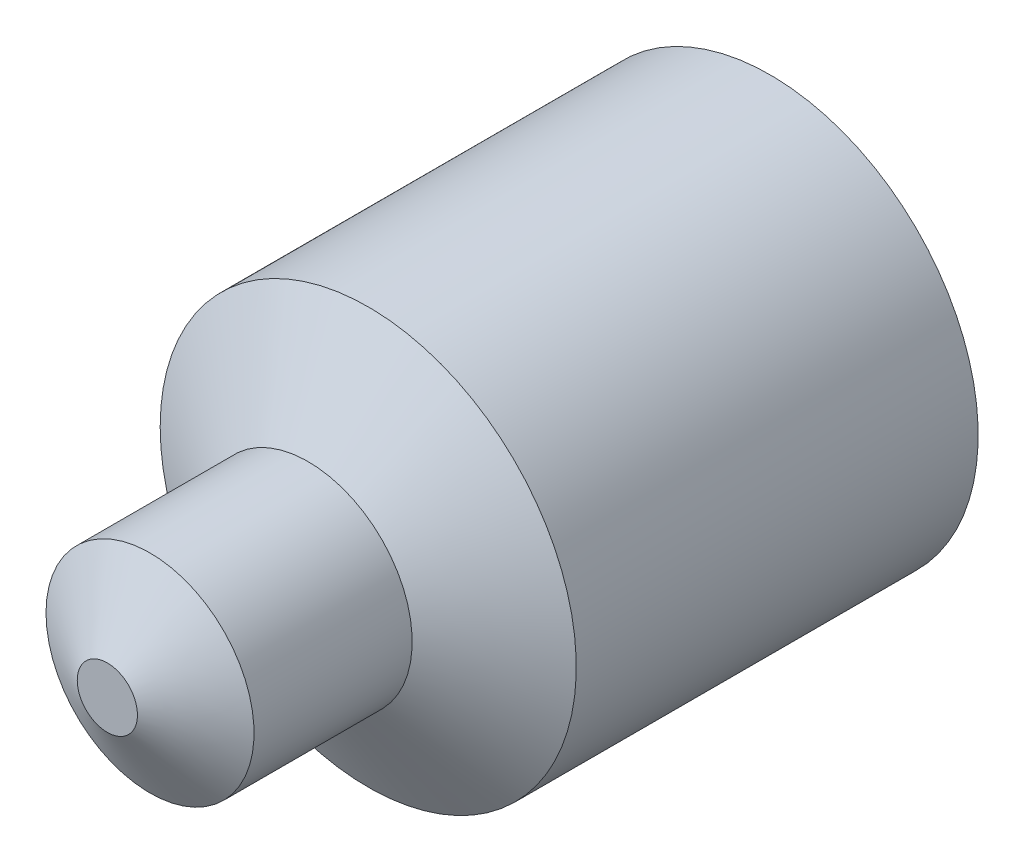
ISO-10303-21;
HEADER;
FILE_DESCRIPTION(('STEP AP214'),'2;1');
FILE_NAME('part.step','',(''),(''),'','','');
FILE_SCHEMA(('AUTOMOTIVE_DESIGN { 1 0 10303 214 1 1 1 1 }'));
ENDSEC;
DATA;
#1=APPLICATION_CONTEXT('core data for automotive mechanical design processes');
#2=APPLICATION_PROTOCOL_DEFINITION('international standard','automotive_design',2000,#1);
#3=PRODUCT_CONTEXT('',#1,'mechanical');
#4=PRODUCT('Part','Part','',(#3));
#5=PRODUCT_RELATED_PRODUCT_CATEGORY('part','',(#4));
#6=PRODUCT_DEFINITION_FORMATION('','',#4);
#7=PRODUCT_DEFINITION_CONTEXT('part definition',#1,'design');
#8=PRODUCT_DEFINITION('design','',#6,#7);
#9=PRODUCT_DEFINITION_SHAPE('','',#8);
#10=(LENGTH_UNIT() NAMED_UNIT(*) SI_UNIT(.MILLI.,.METRE.));
#11=(NAMED_UNIT(*) PLANE_ANGLE_UNIT() SI_UNIT($,.RADIAN.));
#12=(NAMED_UNIT(*) SI_UNIT($,.STERADIAN.) SOLID_ANGLE_UNIT());
#13=UNCERTAINTY_MEASURE_WITH_UNIT(LENGTH_MEASURE(1.E-05),#10,'distance_accuracy_value','');
#14=(GEOMETRIC_REPRESENTATION_CONTEXT(3) GLOBAL_UNCERTAINTY_ASSIGNED_CONTEXT((#13)) GLOBAL_UNIT_ASSIGNED_CONTEXT((#10,
#11,#12)) REPRESENTATION_CONTEXT('',''));
#15=CARTESIAN_POINT('',(0.,0.,0.));
#16=DIRECTION('',(0.,0.,1.));
#17=DIRECTION('',(1.,0.,0.));
#18=AXIS2_PLACEMENT_3D('',#15,#16,#17);
#19=CARTESIAN_POINT('',(0.,36.0025139966327,-37.9705627484772));
#20=DIRECTION('',(0.,0.,1.));
#21=DIRECTION('',(1.,0.,0.));
#22=AXIS2_PLACEMENT_3D('',#19,#20,#21);
#23=PLANE('',#22);
#24=CARTESIAN_POINT('',(0.,36.0025139966327,-37.9705627484772));
#25=DIRECTION('',(0.,0.,1.));
#26=DIRECTION('',(1.,0.,0.));
#27=AXIS2_PLACEMENT_3D('',#24,#25,#26);
#28=CIRCLE('',#27,2.60384757729336);
#29=CARTESIAN_POINT('',(-2.60384757729336,36.0025139966327,-37.9705627484772));
#30=VERTEX_POINT('',#29);
#31=EDGE_CURVE('E25',#30,#30,#28,.T.);
#32=ORIENTED_EDGE('',*,*,#31,.T.);
#33=EDGE_LOOP('',(#32));
#34=FACE_BOUND('',#33,.T.);
#35=ADVANCED_FACE('F16',(#34),#23,.T.);
#36=CARTESIAN_POINT('',(0.,36.0025139966327,-39.6437678292341));
#37=DIRECTION('',(0.,0.,-1.));
#38=DIRECTION('',(1.,0.,0.));
#39=AXIS2_PLACEMENT_3D('',#36,#37,#38);
#40=CONICAL_SURFACE('',#39,5.50192378864668,1.0471975511966);
#41=ORIENTED_EDGE('',*,*,#31,.F.);
#42=DIRECTION('',(-0.866025403784438,0.,-0.5));
#43=VECTOR('',#42,1.);
#44=CARTESIAN_POINT('',(-5.50192378864668,36.0025139966327,-39.6437678292341));
#45=LINE('',#44,#43);
#46=CARTESIAN_POINT('',(-9.,36.0025139966327,-41.6633830715046));
#47=VERTEX_POINT('',#46);
#48=EDGE_CURVE('E10',#30,#47,#45,.T.);
#49=ORIENTED_EDGE('',*,*,#48,.T.);
#50=CARTESIAN_POINT('',(0.,36.0025139966327,-41.6633830715046));
#51=DIRECTION('',(0.,0.,1.));
#52=DIRECTION('',(1.,0.,0.));
#53=AXIS2_PLACEMENT_3D('',#50,#51,#52);
#54=CIRCLE('',#53,9.);
#55=EDGE_CURVE('E121',#47,#47,#54,.T.);
#56=ORIENTED_EDGE('',*,*,#55,.T.);
#57=ORIENTED_EDGE('',*,*,#48,.F.);
#58=EDGE_LOOP('',(#41,#49,#56,#57));
#59=FACE_BOUND('',#58,.T.);
#60=ADVANCED_FACE('F18',(#59),#40,.T.);
#61=CARTESIAN_POINT('',(0.,36.0025139966327,-48.1576521322491));
#62=DIRECTION('',(0.,0.,1.));
#63=DIRECTION('',(1.,0.,0.));
#64=AXIS2_PLACEMENT_3D('',#61,#62,#63);
#65=CYLINDRICAL_SURFACE('',#64,9.);
#66=ORIENTED_EDGE('',*,*,#55,.F.);
#67=DIRECTION('',(0.,0.,-1.));
#68=VECTOR('',#67,1.);
#69=CARTESIAN_POINT('',(-9.,36.0025139966327,-48.1576521322491));
#70=LINE('',#69,#68);
#71=CARTESIAN_POINT('',(-9.,36.0025139966327,-55.344741516021));
#72=VERTEX_POINT('',#71);
#73=EDGE_CURVE('E106',#47,#72,#70,.T.);
#74=ORIENTED_EDGE('',*,*,#73,.T.);
#75=CARTESIAN_POINT('',(0.,36.0025139966327,-55.344741516021));
#76=DIRECTION('',(0.,0.,1.));
#77=DIRECTION('',(1.,0.,0.));
#78=AXIS2_PLACEMENT_3D('',#75,#76,#77);
#79=CIRCLE('',#78,9.);
#80=EDGE_CURVE('E99',#72,#72,#79,.T.);
#81=ORIENTED_EDGE('',*,*,#80,.T.);
#82=ORIENTED_EDGE('',*,*,#73,.F.);
#83=EDGE_LOOP('',(#66,#74,#81,#82));
#84=FACE_BOUND('',#83,.T.);
#85=ADVANCED_FACE('F134',(#84),#65,.T.);
#86=CARTESIAN_POINT('',(0.,36.0025139966327,-57.7696125304742));
#87=DIRECTION('',(0.,0.,-1.));
#88=DIRECTION('',(1.,0.,0.));
#89=AXIS2_PLACEMENT_3D('',#86,#87,#88);
#90=CONICAL_SURFACE('',#89,13.1999997988343,1.04719755119663);
#91=ORIENTED_EDGE('',*,*,#80,.F.);
#92=DIRECTION('',(-0.866025403784454,0.,-0.499999999999974));
#93=VECTOR('',#92,1.);
#94=CARTESIAN_POINT('',(-13.1999997988343,36.0025139966327,-57.7696125304742));
#95=LINE('',#94,#93);
#96=CARTESIAN_POINT('',(-17.9999995976687,36.0025139966327,-60.540893706441));
#97=VERTEX_POINT('',#96);
#98=EDGE_CURVE('E112',#72,#97,#95,.T.);
#99=ORIENTED_EDGE('',*,*,#98,.T.);
#100=CARTESIAN_POINT('',(0.,36.0025139966327,-60.540893706441));
#101=DIRECTION('',(0.,0.,1.));
#102=DIRECTION('',(1.,0.,0.));
#103=AXIS2_PLACEMENT_3D('',#100,#101,#102);
#104=CIRCLE('',#103,17.9999995976687);
#105=EDGE_CURVE('E101',#97,#97,#104,.T.);
#106=ORIENTED_EDGE('',*,*,#105,.T.);
#107=ORIENTED_EDGE('',*,*,#98,.F.);
#108=EDGE_LOOP('',(#91,#99,#106,#107));
#109=FACE_BOUND('',#108,.T.);
#110=ADVANCED_FACE('F138',(#109),#90,.T.);
#111=CARTESIAN_POINT('',(0.,36.0025139966327,-77.9264323434582));
#112=DIRECTION('',(0.,0.,1.));
#113=DIRECTION('',(1.,0.,0.));
#114=AXIS2_PLACEMENT_3D('',#111,#112,#113);
#115=CYLINDRICAL_SURFACE('',#114,17.9999995976687);
#116=ORIENTED_EDGE('',*,*,#105,.F.);
#117=DIRECTION('',(0.,0.,-1.));
#118=VECTOR('',#117,1.);
#119=CARTESIAN_POINT('',(-17.9999995976687,36.0025139966327,-77.9264323434582));
#120=LINE('',#119,#118);
#121=CARTESIAN_POINT('',(-17.9999995976687,36.0025139966327,-95.3119709804754));
#122=VERTEX_POINT('',#121);
#123=EDGE_CURVE('E98',#97,#122,#120,.T.);
#124=ORIENTED_EDGE('',*,*,#123,.T.);
#125=CARTESIAN_POINT('',(0.,36.0025139966327,-95.3119709804754));
#126=DIRECTION('',(0.,0.,1.));
#127=DIRECTION('',(1.,0.,0.));
#128=AXIS2_PLACEMENT_3D('',#125,#126,#127);
#129=CIRCLE('',#128,17.9999995976687);
#130=EDGE_CURVE('E113',#122,#122,#129,.T.);
#131=ORIENTED_EDGE('',*,*,#130,.T.);
#132=ORIENTED_EDGE('',*,*,#123,.F.);
#133=EDGE_LOOP('',(#116,#124,#131,#132));
#134=FACE_BOUND('',#133,.T.);
#135=ADVANCED_FACE('F142',(#134),#115,.T.);
#136=CARTESIAN_POINT('',(0.,36.0025139966327,-97.044021671901));
#137=DIRECTION('',(0.,0.,1.));
#138=DIRECTION('',(1.,0.,0.));
#139=AXIS2_PLACEMENT_3D('',#136,#137,#138);
#140=CONICAL_SURFACE('',#139,14.9999997988343,1.0471975511966);
#141=ORIENTED_EDGE('',*,*,#130,.F.);
#142=DIRECTION('',(0.866025403784438,0.,-0.5));
#143=VECTOR('',#142,1.);
#144=CARTESIAN_POINT('',(-14.9999997988343,36.0025139966327,-97.044021671901));
#145=LINE('',#144,#143);
#146=CARTESIAN_POINT('',(-12.,36.0025139966327,-98.7760723633272));
#147=VERTEX_POINT('',#146);
#148=EDGE_CURVE('E115',#122,#147,#145,.T.);
#149=ORIENTED_EDGE('',*,*,#148,.T.);
#150=CARTESIAN_POINT('',(0.,36.0025139966327,-98.7760723633272));
#151=DIRECTION('',(0.,0.,1.));
#152=DIRECTION('',(1.,0.,0.));
#153=AXIS2_PLACEMENT_3D('',#150,#151,#152);
#154=CIRCLE('',#153,12.);
#155=EDGE_CURVE('E79',#147,#147,#154,.T.);
#156=ORIENTED_EDGE('',*,*,#155,.T.);
#157=ORIENTED_EDGE('',*,*,#148,.F.);
#158=EDGE_LOOP('',(#141,#149,#156,#157));
#159=FACE_BOUND('',#158,.T.);
#160=ADVANCED_FACE('F148',(#159),#140,.T.);
#161=CARTESIAN_POINT('',(12.,36.0025139966327,-98.7760723633272));
#162=DIRECTION('',(0.,0.,-1.));
#163=DIRECTION('',(0.,-1.,0.));
#164=AXIS2_PLACEMENT_3D('',#161,#162,#163);
#165=PLANE('',#164);
#166=CARTESIAN_POINT('',(0.,36.0025139966327,-98.7760723633272));
#167=DIRECTION('',(0.,0.,1.));
#168=DIRECTION('',(1.,0.,0.));
#169=AXIS2_PLACEMENT_3D('',#166,#167,#168);
#170=CIRCLE('',#169,9.6);
#171=CARTESIAN_POINT('',(-9.6,36.0025139966327,-98.7760723633272));
#172=VERTEX_POINT('',#171);
#173=EDGE_CURVE('E77',#172,#172,#170,.T.);
#174=ORIENTED_EDGE('',*,*,#173,.T.);
#175=EDGE_LOOP('',(#174));
#176=FACE_BOUND('',#175,.T.);
#177=ORIENTED_EDGE('',*,*,#155,.F.);
#178=EDGE_LOOP('',(#177));
#179=FACE_BOUND('',#178,.T.);
#180=ADVANCED_FACE('F149',(#176,#179),#165,.T.);
#181=CARTESIAN_POINT('',(0.,36.0025139966327,-98.7760723633272));
#182=DIRECTION('',(0.,0.,1.));
#183=DIRECTION('',(1.,0.,0.));
#184=AXIS2_PLACEMENT_3D('',#181,#182,#183);
#185=CYLINDRICAL_SURFACE('',#184,9.6);
#186=ORIENTED_EDGE('',*,*,#173,.F.);
#187=DIRECTION('',(0.,0.,1.));
#188=VECTOR('',#187,1.);
#189=CARTESIAN_POINT('',(-9.6,36.0025139966327,-98.7760723633272));
#190=LINE('',#189,#188);
#191=CARTESIAN_POINT('',(-9.6,36.0025139966327,-80.1760723633272));
#192=VERTEX_POINT('',#191);
#193=EDGE_CURVE('E71',#172,#192,#190,.T.);
#194=ORIENTED_EDGE('',*,*,#193,.T.);
#195=CARTESIAN_POINT('',(0.,36.0025139966327,-80.1760723633272));
#196=DIRECTION('',(0.,0.,1.));
#197=DIRECTION('',(1.,0.,0.));
#198=AXIS2_PLACEMENT_3D('',#195,#196,#197);
#199=CIRCLE('',#198,9.6);
#200=EDGE_CURVE('E76',#192,#192,#199,.T.);
#201=ORIENTED_EDGE('',*,*,#200,.T.);
#202=ORIENTED_EDGE('',*,*,#193,.F.);
#203=EDGE_LOOP('',(#186,#194,#201,#202));
#204=FACE_BOUND('',#203,.T.);
#205=ADVANCED_FACE('F72',(#204),#185,.F.);
#206=CARTESIAN_POINT('',(0.,36.0025139966327,-75.3760723633272));
#207=DIRECTION('',(0.,0.,-1.));
#208=DIRECTION('',(0.,-1.,0.));
#209=AXIS2_PLACEMENT_3D('',#206,#207,#208);
#210=PLANE('',#209);
#211=CARTESIAN_POINT('',(0.,36.0025139966327,-75.3760723633272));
#212=DIRECTION('',(0.,0.,-1.));
#213=DIRECTION('',(1.,0.,0.));
#214=AXIS2_PLACEMENT_3D('',#211,#212,#213);
#215=CIRCLE('',#214,1.28615612366939);
#216=CARTESIAN_POINT('',(-1.28615612366938,36.0025139966327,-75.3760723633272));
#217=VERTEX_POINT('',#216);
#218=EDGE_CURVE('E87',#217,#217,#215,.T.);
#219=ORIENTED_EDGE('',*,*,#218,.T.);
#220=EDGE_LOOP('',(#219));
#221=FACE_BOUND('',#220,.T.);
#222=ADVANCED_FACE('F158',(#221),#210,.T.);
#223=CARTESIAN_POINT('',(0.,36.0025139966327,-80.1760723633272));
#224=DIRECTION('',(0.,0.,-1.));
#225=DIRECTION('',(1.,0.,0.));
#226=AXIS2_PLACEMENT_3D('',#223,#224,#225);
#227=CONICAL_SURFACE('',#226,9.6,1.0471975511966);
#228=ORIENTED_EDGE('',*,*,#200,.F.);
#229=DIRECTION('',(0.866025403784439,0.,0.5));
#230=VECTOR('',#229,1.);
#231=CARTESIAN_POINT('',(-9.6,36.0025139966327,-80.1760723633272));
#232=LINE('',#231,#230);
#233=EDGE_CURVE('E84',#192,#217,#232,.T.);
#234=ORIENTED_EDGE('',*,*,#233,.T.);
#235=ORIENTED_EDGE('',*,*,#218,.F.);
#236=ORIENTED_EDGE('',*,*,#233,.F.);
#237=EDGE_LOOP('',(#228,#234,#235,#236));
#238=FACE_BOUND('',#237,.T.);
#239=ADVANCED_FACE('F88',(#238),#227,.F.);
#240=CLOSED_SHELL('',(#35,#60,#85,#110,#135,#160,#180,#205,#222,#239));
#241=MANIFOLD_SOLID_BREP('B1',#240);
#242=ADVANCED_BREP_SHAPE_REPRESENTATION('',(#18,#241),#14);
#243=SHAPE_DEFINITION_REPRESENTATION(#9,#242);
ENDSEC;
END-ISO-10303-21;
